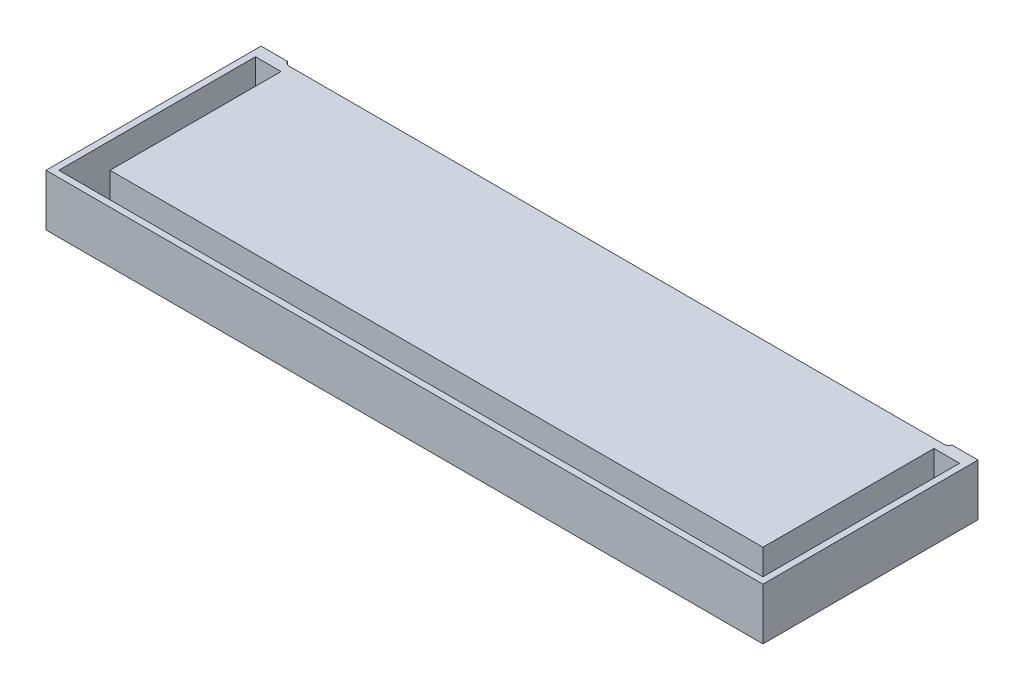
ISO-10303-21;
HEADER;
FILE_DESCRIPTION(('STEP AP214'),'2;1');
FILE_NAME('part.step','',(''),(''),'','','');
FILE_SCHEMA(('AUTOMOTIVE_DESIGN { 1 0 10303 214 1 1 1 1 }'));
ENDSEC;
DATA;
#1=APPLICATION_CONTEXT('core data for automotive mechanical design processes');
#2=APPLICATION_PROTOCOL_DEFINITION('international standard','automotive_design',2000,#1);
#3=PRODUCT_CONTEXT('',#1,'mechanical');
#4=PRODUCT('Part','Part','',(#3));
#5=PRODUCT_RELATED_PRODUCT_CATEGORY('part','',(#4));
#6=PRODUCT_DEFINITION_FORMATION('','',#4);
#7=PRODUCT_DEFINITION_CONTEXT('part definition',#1,'design');
#8=PRODUCT_DEFINITION('design','',#6,#7);
#9=PRODUCT_DEFINITION_SHAPE('','',#8);
#10=(LENGTH_UNIT() NAMED_UNIT(*) SI_UNIT(.MILLI.,.METRE.));
#11=(NAMED_UNIT(*) PLANE_ANGLE_UNIT() SI_UNIT($,.RADIAN.));
#12=(NAMED_UNIT(*) SI_UNIT($,.STERADIAN.) SOLID_ANGLE_UNIT());
#13=UNCERTAINTY_MEASURE_WITH_UNIT(LENGTH_MEASURE(1.E-05),#10,'distance_accuracy_value','');
#14=(GEOMETRIC_REPRESENTATION_CONTEXT(3) GLOBAL_UNCERTAINTY_ASSIGNED_CONTEXT((#13)) GLOBAL_UNIT_ASSIGNED_CONTEXT((#10,
#11,#12)) REPRESENTATION_CONTEXT('',''));
#15=CARTESIAN_POINT('',(0.,0.,0.));
#16=DIRECTION('',(0.,0.,1.));
#17=DIRECTION('',(1.,0.,0.));
#18=AXIS2_PLACEMENT_3D('',#15,#16,#17);
#19=CARTESIAN_POINT('',(157.5,-68.1212867515907,56.6819062459587));
#20=DIRECTION('',(0.,0.,1.));
#21=DIRECTION('',(1.,0.,0.));
#22=AXIS2_PLACEMENT_3D('',#19,#20,#21);
#23=PLANE('',#22);
#24=DIRECTION('',(1.,0.,0.));
#25=VECTOR('',#24,1.);
#26=CARTESIAN_POINT('',(157.5,-66.1009999999994,56.6819062459587));
#27=LINE('',#26,#25);
#28=CARTESIAN_POINT('',(144.719525115767,-66.1009999999995,56.6819062459588));
#29=VERTEX_POINT('',#28);
#30=CARTESIAN_POINT('',(170.299999999999,-66.1009999999994,56.6819062459587));
#31=VERTEX_POINT('',#30);
#32=EDGE_CURVE('E233',#29,#31,#27,.T.);
#33=ORIENTED_EDGE('',*,*,#32,.T.);
#34=DIRECTION('',(0.,1.,0.));
#35=VECTOR('',#34,1.);
#36=CARTESIAN_POINT('',(170.299999999999,-68.1212867515907,56.6819062459587));
#37=LINE('',#36,#35);
#38=CARTESIAN_POINT('',(170.299999999999,-68.1212867515907,56.6819062459587));
#39=VERTEX_POINT('',#38);
#40=EDGE_CURVE('E36',#39,#31,#37,.T.);
#41=ORIENTED_EDGE('',*,*,#40,.F.);
#42=DIRECTION('',(1.,0.,0.));
#43=VECTOR('',#42,1.);
#44=CARTESIAN_POINT('',(157.5,-68.1212867515907,56.6819062459587));
#45=LINE('',#44,#43);
#46=CARTESIAN_POINT('',(144.719525115767,-68.1212867515908,56.6819062459588));
#47=VERTEX_POINT('',#46);
#48=EDGE_CURVE('E234',#47,#39,#45,.T.);
#49=ORIENTED_EDGE('',*,*,#48,.F.);
#50=CARTESIAN_POINT('',(144.719525115767,-66.1009999999995,56.6819062459582));
#51=DIRECTION('',(0.,-1.,0.));
#52=VECTOR('',#51,1.);
#53=LINE('',#50,#52);
#54=EDGE_CURVE('E10',#47,#29,#53,.F.);
#55=ORIENTED_EDGE('',*,*,#54,.T.);
#56=EDGE_LOOP('',(#33,#41,#49,#55));
#57=FACE_BOUND('',#56,.T.);
#58=ADVANCED_FACE('F16',(#57),#23,.F.);
#59=CARTESIAN_POINT('',(144.719525115767,-68.121286751594,56.6819062459582));
#60=CARTESIAN_POINT('',(144.63714146266,-68.121286751594,56.6818638421737));
#61=CARTESIAN_POINT('',(144.559411452345,-68.1212867515908,56.6271764319075));
#62=CARTESIAN_POINT('',(144.530820390872,-68.1212867515908,56.5499999999999));
#63=B_SPLINE_CURVE_WITH_KNOTS('',3,(#59,#60,#61,#62),.UNSPECIFIED.,.F.,.F.,(4,4),(0.,1.),.UNSPECIFIED.);
#64=DIRECTION('',(0.,1.,0.));
#65=VECTOR('',#64,1.);
#66=SURFACE_OF_LINEAR_EXTRUSION('',#63,#65);
#67=CARTESIAN_POINT('',(144.530820390872,-66.1009999999995,56.5499999999999));
#68=CARTESIAN_POINT('',(144.559411452345,-66.1009999999995,56.6271764319075));
#69=CARTESIAN_POINT('',(144.63714146266,-66.1010000000027,56.6818638421737));
#70=CARTESIAN_POINT('',(144.719525115767,-66.1010000000027,56.6819062459582));
#71=B_SPLINE_CURVE_WITH_KNOTS('',3,(#67,#68,#69,#70),.UNSPECIFIED.,.F.,.F.,(4,4),(0.,1.),.UNSPECIFIED.);
#72=CARTESIAN_POINT('',(144.530820390872,-66.1009999999995,56.5499999999999));
#73=VERTEX_POINT('',#72);
#74=EDGE_CURVE('E236',#29,#73,#71,.F.);
#75=ORIENTED_EDGE('',*,*,#74,.F.);
#76=ORIENTED_EDGE('',*,*,#54,.F.);
#77=CARTESIAN_POINT('',(144.719525115767,-68.1212867515908,56.6819062459582));
#78=CARTESIAN_POINT('',(144.63714146266,-68.1212867515908,56.6818638421737));
#79=CARTESIAN_POINT('',(144.559411452345,-68.1212867515876,56.6271764319075));
#80=CARTESIAN_POINT('',(144.530820390872,-68.1212867515876,56.5499999999999));
#81=B_SPLINE_CURVE_WITH_KNOTS('',3,(#77,#78,#79,#80),.UNSPECIFIED.,.F.,.F.,(4,4),(0.,1.),.UNSPECIFIED.);
#82=CARTESIAN_POINT('',(144.530820390872,-68.1212867515908,56.5499999999999));
#83=VERTEX_POINT('',#82);
#84=EDGE_CURVE('E176',#47,#83,#81,.T.);
#85=ORIENTED_EDGE('',*,*,#84,.T.);
#86=CARTESIAN_POINT('',(144.530820390872,-68.1212867515908,56.5499999999999));
#87=DIRECTION('',(0.,1.,0.));
#88=VECTOR('',#87,1.);
#89=LINE('',#86,#88);
#90=EDGE_CURVE('E28',#83,#73,#89,.T.);
#91=ORIENTED_EDGE('',*,*,#90,.T.);
#92=EDGE_LOOP('',(#75,#76,#85,#91));
#93=FACE_BOUND('',#92,.T.);
#94=ADVANCED_FACE('F188',(#93),#66,.T.);
#95=CARTESIAN_POINT('',(157.5,-68.1212867515907,56.5499999999999));
#96=DIRECTION('',(0.,0.,-1.));
#97=DIRECTION('',(-1.,0.,0.));
#98=AXIS2_PLACEMENT_3D('',#95,#96,#97);
#99=PLANE('',#98);
#100=DIRECTION('',(-1.,0.,0.));
#101=VECTOR('',#100,1.);
#102=CARTESIAN_POINT('',(157.5,-66.1009999999994,56.5499999999999));
#103=LINE('',#102,#101);
#104=CARTESIAN_POINT('',(143.5,-66.1009999999995,56.5499999999999));
#105=VERTEX_POINT('',#104);
#106=EDGE_CURVE('E240',#73,#105,#103,.T.);
#107=ORIENTED_EDGE('',*,*,#106,.F.);
#108=ORIENTED_EDGE('',*,*,#90,.F.);
#109=DIRECTION('',(-1.,0.,0.));
#110=VECTOR('',#109,1.);
#111=CARTESIAN_POINT('',(157.5,-68.1212867515907,56.5499999999999));
#112=LINE('',#111,#110);
#113=CARTESIAN_POINT('',(143.5,-68.1212867515908,56.5499999999999));
#114=VERTEX_POINT('',#113);
#115=EDGE_CURVE('E172',#83,#114,#112,.T.);
#116=ORIENTED_EDGE('',*,*,#115,.T.);
#117=DIRECTION('',(0.,1.,0.));
#118=VECTOR('',#117,1.);
#119=CARTESIAN_POINT('',(143.5,-68.1212867515908,56.5499999999999));
#120=LINE('',#119,#118);
#121=EDGE_CURVE('E345',#114,#105,#120,.T.);
#122=ORIENTED_EDGE('',*,*,#121,.T.);
#123=EDGE_LOOP('',(#107,#108,#116,#122));
#124=FACE_BOUND('',#123,.T.);
#125=ADVANCED_FACE('F192',(#124),#99,.T.);
#126=CARTESIAN_POINT('',(143.5,-68.1212867515908,63.6999999999999));
#127=DIRECTION('',(-1.,0.,0.));
#128=DIRECTION('',(0.,-1.,0.));
#129=AXIS2_PLACEMENT_3D('',#126,#127,#128);
#130=PLANE('',#129);
#131=DIRECTION('',(0.,0.,1.));
#132=VECTOR('',#131,1.);
#133=CARTESIAN_POINT('',(143.5,-66.1009999999995,63.6999999999999));
#134=LINE('',#133,#132);
#135=CARTESIAN_POINT('',(143.5,-66.1009999999995,64.9499999999999));
#136=VERTEX_POINT('',#135);
#137=EDGE_CURVE('E257',#105,#136,#134,.T.);
#138=ORIENTED_EDGE('',*,*,#137,.F.);
#139=ORIENTED_EDGE('',*,*,#121,.F.);
#140=DIRECTION('',(0.,0.,1.));
#141=VECTOR('',#140,1.);
#142=CARTESIAN_POINT('',(143.5,-68.1212867515908,63.6999999999999));
#143=LINE('',#142,#141);
#144=CARTESIAN_POINT('',(143.5,-68.1212867515908,64.9499999999999));
#145=VERTEX_POINT('',#144);
#146=EDGE_CURVE('E169',#114,#145,#143,.T.);
#147=ORIENTED_EDGE('',*,*,#146,.T.);
#148=DIRECTION('',(0.,1.,0.));
#149=VECTOR('',#148,1.);
#150=CARTESIAN_POINT('',(143.5,-68.1212867515908,64.9499999999999));
#151=LINE('',#150,#149);
#152=EDGE_CURVE('E347',#145,#136,#151,.T.);
#153=ORIENTED_EDGE('',*,*,#152,.T.);
#154=EDGE_LOOP('',(#138,#139,#147,#153));
#155=FACE_BOUND('',#154,.T.);
#156=ADVANCED_FACE('F194',(#155),#130,.T.);
#157=CARTESIAN_POINT('',(157.5,-68.1212867515907,64.9499999999999));
#158=DIRECTION('',(0.,0.,1.));
#159=DIRECTION('',(1.,0.,0.));
#160=AXIS2_PLACEMENT_3D('',#157,#158,#159);
#161=PLANE('',#160);
#162=DIRECTION('',(1.,0.,0.));
#163=VECTOR('',#162,1.);
#164=CARTESIAN_POINT('',(157.5,-66.1009999999994,64.9499999999999));
#165=LINE('',#164,#163);
#166=CARTESIAN_POINT('',(171.5,-66.1009999999994,64.9499999999999));
#167=VERTEX_POINT('',#166);
#168=EDGE_CURVE('E264',#136,#167,#165,.T.);
#169=ORIENTED_EDGE('',*,*,#168,.F.);
#170=ORIENTED_EDGE('',*,*,#152,.F.);
#171=DIRECTION('',(1.,0.,0.));
#172=VECTOR('',#171,1.);
#173=CARTESIAN_POINT('',(157.5,-68.1212867515907,64.9499999999999));
#174=LINE('',#173,#172);
#175=CARTESIAN_POINT('',(171.5,-68.1212867515907,64.9499999999999));
#176=VERTEX_POINT('',#175);
#177=EDGE_CURVE('E156',#145,#176,#174,.T.);
#178=ORIENTED_EDGE('',*,*,#177,.T.);
#179=DIRECTION('',(0.,1.,0.));
#180=VECTOR('',#179,1.);
#181=CARTESIAN_POINT('',(171.5,-68.1212867515907,64.9499999999999));
#182=LINE('',#181,#180);
#183=EDGE_CURVE('E148',#176,#167,#182,.T.);
#184=ORIENTED_EDGE('',*,*,#183,.T.);
#185=EDGE_LOOP('',(#169,#170,#178,#184));
#186=FACE_BOUND('',#185,.T.);
#187=ADVANCED_FACE('F411',(#186),#161,.T.);
#188=CARTESIAN_POINT('',(171.5,-68.1212867515907,63.6999999999999));
#189=DIRECTION('',(1.,0.,0.));
#190=DIRECTION('',(0.,1.,0.));
#191=AXIS2_PLACEMENT_3D('',#188,#189,#190);
#192=PLANE('',#191);
#193=DIRECTION('',(0.,0.,-1.));
#194=VECTOR('',#193,1.);
#195=CARTESIAN_POINT('',(171.5,-66.1009999999994,63.6999999999999));
#196=LINE('',#195,#194);
#197=CARTESIAN_POINT('',(171.5,-66.1009999999994,56.5499999999999));
#198=VERTEX_POINT('',#197);
#199=EDGE_CURVE('E260',#167,#198,#196,.T.);
#200=ORIENTED_EDGE('',*,*,#199,.F.);
#201=ORIENTED_EDGE('',*,*,#183,.F.);
#202=DIRECTION('',(0.,0.,-1.));
#203=VECTOR('',#202,1.);
#204=CARTESIAN_POINT('',(171.5,-68.1212867515907,63.6999999999999));
#205=LINE('',#204,#203);
#206=CARTESIAN_POINT('',(171.5,-68.1212867515907,56.5499999999999));
#207=VERTEX_POINT('',#206);
#208=EDGE_CURVE('E151',#176,#207,#205,.T.);
#209=ORIENTED_EDGE('',*,*,#208,.T.);
#210=DIRECTION('',(0.,1.,0.));
#211=VECTOR('',#210,1.);
#212=CARTESIAN_POINT('',(171.5,-68.1212867515907,56.5499999999999));
#213=LINE('',#212,#211);
#214=EDGE_CURVE('E137',#207,#198,#213,.T.);
#215=ORIENTED_EDGE('',*,*,#214,.T.);
#216=EDGE_LOOP('',(#200,#201,#209,#215));
#217=FACE_BOUND('',#216,.T.);
#218=ADVANCED_FACE('F152',(#217),#192,.T.);
#219=CARTESIAN_POINT('',(170.487868651815,-66.1009999999994,56.5499999999999));
#220=VERTEX_POINT('',#219);
#221=EDGE_CURVE('E144',#198,#220,#103,.T.);
#222=ORIENTED_EDGE('',*,*,#221,.F.);
#223=ORIENTED_EDGE('',*,*,#214,.F.);
#224=CARTESIAN_POINT('',(170.487868651815,-68.1212867515907,56.5499999999999));
#225=VERTEX_POINT('',#224);
#226=EDGE_CURVE('E141',#207,#225,#112,.T.);
#227=ORIENTED_EDGE('',*,*,#226,.T.);
#228=DIRECTION('',(0.,1.,0.));
#229=VECTOR('',#228,1.);
#230=CARTESIAN_POINT('',(170.487868651815,-68.1212867515907,56.5499999999999));
#231=LINE('',#230,#229);
#232=EDGE_CURVE('E88',#225,#220,#231,.T.);
#233=ORIENTED_EDGE('',*,*,#232,.T.);
#234=EDGE_LOOP('',(#222,#223,#227,#233));
#235=FACE_BOUND('',#234,.T.);
#236=ADVANCED_FACE('F139',(#235),#99,.T.);
#237=CARTESIAN_POINT('',(157.5,-68.1212867515907,63.6999999999999));
#238=DIRECTION('',(0.,0.,-1.));
#239=DIRECTION('',(-1.,0.,0.));
#240=AXIS2_PLACEMENT_3D('',#237,#238,#239);
#241=PLANE('',#240);
#242=DIRECTION('',(-1.,0.,0.));
#243=VECTOR('',#242,1.);
#244=CARTESIAN_POINT('',(157.5,-66.1009999999994,63.6999999999999));
#245=LINE('',#244,#243);
#246=CARTESIAN_POINT('',(170.25,-66.1009999999994,63.6999999999999));
#247=VERTEX_POINT('',#246);
#248=CARTESIAN_POINT('',(144.75,-66.1009999999995,63.6999999999999));
#249=VERTEX_POINT('',#248);
#250=EDGE_CURVE('E295',#247,#249,#245,.T.);
#251=ORIENTED_EDGE('',*,*,#250,.T.);
#252=DIRECTION('',(0.,1.,0.));
#253=VECTOR('',#252,1.);
#254=CARTESIAN_POINT('',(144.75,-68.1212867515908,63.6999999999999));
#255=LINE('',#254,#253);
#256=CARTESIAN_POINT('',(144.75,-68.1212867515908,63.6999999999999));
#257=VERTEX_POINT('',#256);
#258=EDGE_CURVE('E162',#257,#249,#255,.T.);
#259=ORIENTED_EDGE('',*,*,#258,.F.);
#260=DIRECTION('',(-1.,0.,0.));
#261=VECTOR('',#260,1.);
#262=CARTESIAN_POINT('',(157.5,-68.1212867515907,63.6999999999999));
#263=LINE('',#262,#261);
#264=CARTESIAN_POINT('',(170.25,-68.1212867515907,63.6999999999999));
#265=VERTEX_POINT('',#264);
#266=EDGE_CURVE('E269',#265,#257,#263,.T.);
#267=ORIENTED_EDGE('',*,*,#266,.F.);
#268=DIRECTION('',(0.,1.,0.));
#269=VECTOR('',#268,1.);
#270=CARTESIAN_POINT('',(170.25,-68.1212867515907,63.6999999999999));
#271=LINE('',#270,#269);
#272=EDGE_CURVE('E99',#265,#247,#271,.T.);
#273=ORIENTED_EDGE('',*,*,#272,.T.);
#274=EDGE_LOOP('',(#251,#259,#267,#273));
#275=FACE_BOUND('',#274,.T.);
#276=ADVANCED_FACE('F18',(#275),#241,.F.);
#277=CARTESIAN_POINT('',(170.25,-68.1212867515907,63.6999999999999));
#278=DIRECTION('',(-1.,0.,0.));
#279=DIRECTION('',(0.,-1.,0.));
#280=AXIS2_PLACEMENT_3D('',#277,#278,#279);
#281=PLANE('',#280);
#282=DIRECTION('',(0.,0.,1.));
#283=VECTOR('',#282,1.);
#284=CARTESIAN_POINT('',(170.25,-66.1009999999994,63.6999999999999));
#285=LINE('',#284,#283);
#286=CARTESIAN_POINT('',(170.25,-66.1009999999994,57.0186341701512));
#287=VERTEX_POINT('',#286);
#288=EDGE_CURVE('E298',#287,#247,#285,.T.);
#289=ORIENTED_EDGE('',*,*,#288,.T.);
#290=ORIENTED_EDGE('',*,*,#272,.F.);
#291=DIRECTION('',(0.,0.,1.));
#292=VECTOR('',#291,1.);
#293=CARTESIAN_POINT('',(170.25,-68.1212867515907,63.6999999999999));
#294=LINE('',#293,#292);
#295=CARTESIAN_POINT('',(170.25,-68.1212867515907,57.0186341701512));
#296=VERTEX_POINT('',#295);
#297=EDGE_CURVE('E380',#296,#265,#294,.T.);
#298=ORIENTED_EDGE('',*,*,#297,.F.);
#299=DIRECTION('',(0.,1.,0.));
#300=VECTOR('',#299,1.);
#301=CARTESIAN_POINT('',(170.25,-68.1212867515907,57.0186341701512));
#302=LINE('',#301,#300);
#303=EDGE_CURVE('E340',#296,#287,#302,.T.);
#304=ORIENTED_EDGE('',*,*,#303,.T.);
#305=EDGE_LOOP('',(#289,#290,#298,#304));
#306=FACE_BOUND('',#305,.T.);
#307=ADVANCED_FACE('F358',(#306),#281,.F.);
#308=CARTESIAN_POINT('',(157.5,-68.1212867515907,57.0186341701512));
#309=DIRECTION('',(0.,0.,-1.));
#310=DIRECTION('',(-1.,0.,0.));
#311=AXIS2_PLACEMENT_3D('',#308,#309,#310);
#312=PLANE('',#311);
#313=DIRECTION('',(1.,0.,0.));
#314=VECTOR('',#313,1.);
#315=CARTESIAN_POINT('',(157.5,-66.1009999999994,57.0186341701512));
#316=LINE('',#315,#314);
#317=CARTESIAN_POINT('',(171.25,-66.1009999999994,57.0186341701512));
#318=VERTEX_POINT('',#317);
#319=EDGE_CURVE('E300',#318,#287,#316,.F.);
#320=ORIENTED_EDGE('',*,*,#319,.T.);
#321=ORIENTED_EDGE('',*,*,#303,.F.);
#322=DIRECTION('',(1.,0.,0.));
#323=VECTOR('',#322,1.);
#324=CARTESIAN_POINT('',(157.5,-68.1212867515907,57.0186341701512));
#325=LINE('',#324,#323);
#326=CARTESIAN_POINT('',(171.25,-68.1212867515907,57.0186341701512));
#327=VERTEX_POINT('',#326);
#328=EDGE_CURVE('E364',#327,#296,#325,.F.);
#329=ORIENTED_EDGE('',*,*,#328,.F.);
#330=DIRECTION('',(0.,1.,0.));
#331=VECTOR('',#330,1.);
#332=CARTESIAN_POINT('',(171.25,-68.1212867515907,57.0186341701512));
#333=LINE('',#332,#331);
#334=EDGE_CURVE('E338',#327,#318,#333,.T.);
#335=ORIENTED_EDGE('',*,*,#334,.T.);
#336=EDGE_LOOP('',(#320,#321,#329,#335));
#337=FACE_BOUND('',#336,.T.);
#338=ADVANCED_FACE('F361',(#337),#312,.F.);
#339=CARTESIAN_POINT('',(171.25,-68.1212867515907,63.6999999999999));
#340=DIRECTION('',(1.,0.,0.));
#341=DIRECTION('',(0.,1.,0.));
#342=AXIS2_PLACEMENT_3D('',#339,#340,#341);
#343=PLANE('',#342);
#344=DIRECTION('',(0.,0.,-1.));
#345=VECTOR('',#344,1.);
#346=CARTESIAN_POINT('',(171.25,-66.1009999999994,63.6999999999999));
#347=LINE('',#346,#345);
#348=CARTESIAN_POINT('',(171.25,-66.1009999999994,64.6999999999999));
#349=VERTEX_POINT('',#348);
#350=EDGE_CURVE('E303',#349,#318,#347,.T.);
#351=ORIENTED_EDGE('',*,*,#350,.T.);
#352=ORIENTED_EDGE('',*,*,#334,.F.);
#353=DIRECTION('',(0.,0.,-1.));
#354=VECTOR('',#353,1.);
#355=CARTESIAN_POINT('',(171.25,-68.1212867515907,63.6999999999999));
#356=LINE('',#355,#354);
#357=CARTESIAN_POINT('',(171.25,-68.1212867515907,64.6999999999999));
#358=VERTEX_POINT('',#357);
#359=EDGE_CURVE('E369',#358,#327,#356,.T.);
#360=ORIENTED_EDGE('',*,*,#359,.F.);
#361=DIRECTION('',(0.,1.,0.));
#362=VECTOR('',#361,1.);
#363=CARTESIAN_POINT('',(171.25,-68.1212867515907,64.6999999999999));
#364=LINE('',#363,#362);
#365=EDGE_CURVE('E332',#358,#349,#364,.T.);
#366=ORIENTED_EDGE('',*,*,#365,.T.);
#367=EDGE_LOOP('',(#351,#352,#360,#366));
#368=FACE_BOUND('',#367,.T.);
#369=ADVANCED_FACE('F368',(#368),#343,.F.);
#370=CARTESIAN_POINT('',(157.5,-68.1212867515907,64.6999999999999));
#371=DIRECTION('',(0.,0.,1.));
#372=DIRECTION('',(0.,-1.,0.));
#373=AXIS2_PLACEMENT_3D('',#370,#371,#372);
#374=PLANE('',#373);
#375=DIRECTION('',(1.,0.,0.));
#376=VECTOR('',#375,1.);
#377=CARTESIAN_POINT('',(157.5,-66.1009999999994,64.6999999999999));
#378=LINE('',#377,#376);
#379=CARTESIAN_POINT('',(143.75,-66.1009999999995,64.6999999999999));
#380=VERTEX_POINT('',#379);
#381=EDGE_CURVE('E306',#380,#349,#378,.T.);
#382=ORIENTED_EDGE('',*,*,#381,.T.);
#383=ORIENTED_EDGE('',*,*,#365,.F.);
#384=DIRECTION('',(1.,0.,0.));
#385=VECTOR('',#384,1.);
#386=CARTESIAN_POINT('',(157.5,-68.1212867515907,64.6999999999999));
#387=LINE('',#386,#385);
#388=CARTESIAN_POINT('',(143.75,-68.1212867515908,64.6999999999999));
#389=VERTEX_POINT('',#388);
#390=EDGE_CURVE('E373',#389,#358,#387,.T.);
#391=ORIENTED_EDGE('',*,*,#390,.F.);
#392=DIRECTION('',(0.,1.,0.));
#393=VECTOR('',#392,1.);
#394=CARTESIAN_POINT('',(143.75,-68.1212867515908,64.6999999999999));
#395=LINE('',#394,#393);
#396=EDGE_CURVE('E326',#389,#380,#395,.T.);
#397=ORIENTED_EDGE('',*,*,#396,.T.);
#398=EDGE_LOOP('',(#382,#383,#391,#397));
#399=FACE_BOUND('',#398,.T.);
#400=ADVANCED_FACE('F372',(#399),#374,.F.);
#401=CARTESIAN_POINT('',(143.75,-68.1212867515908,63.6999999999999));
#402=DIRECTION('',(-1.,0.,0.));
#403=DIRECTION('',(0.,-1.,0.));
#404=AXIS2_PLACEMENT_3D('',#401,#402,#403);
#405=PLANE('',#404);
#406=DIRECTION('',(0.,0.,1.));
#407=VECTOR('',#406,1.);
#408=CARTESIAN_POINT('',(143.75,-66.1009999999995,63.6999999999999));
#409=LINE('',#408,#407);
#410=CARTESIAN_POINT('',(143.75,-66.1009999999995,57.0186341701512));
#411=VERTEX_POINT('',#410);
#412=EDGE_CURVE('E309',#411,#380,#409,.T.);
#413=ORIENTED_EDGE('',*,*,#412,.T.);
#414=ORIENTED_EDGE('',*,*,#396,.F.);
#415=DIRECTION('',(0.,0.,1.));
#416=VECTOR('',#415,1.);
#417=CARTESIAN_POINT('',(143.75,-68.1212867515908,63.6999999999999));
#418=LINE('',#417,#416);
#419=CARTESIAN_POINT('',(143.75,-68.1212867515908,57.0186341701512));
#420=VERTEX_POINT('',#419);
#421=EDGE_CURVE('E329',#420,#389,#418,.T.);
#422=ORIENTED_EDGE('',*,*,#421,.F.);
#423=DIRECTION('',(0.,1.,0.));
#424=VECTOR('',#423,1.);
#425=CARTESIAN_POINT('',(143.75,-68.1212867515908,57.0186341701512));
#426=LINE('',#425,#424);
#427=EDGE_CURVE('E317',#420,#411,#426,.T.);
#428=ORIENTED_EDGE('',*,*,#427,.T.);
#429=EDGE_LOOP('',(#413,#414,#422,#428));
#430=FACE_BOUND('',#429,.T.);
#431=ADVANCED_FACE('F325',(#430),#405,.F.);
#432=CARTESIAN_POINT('',(157.5,-68.1212867515907,57.0186341701512));
#433=DIRECTION('',(0.,0.,-1.));
#434=DIRECTION('',(-1.,0.,0.));
#435=AXIS2_PLACEMENT_3D('',#432,#433,#434);
#436=PLANE('',#435);
#437=DIRECTION('',(1.,0.,0.));
#438=VECTOR('',#437,1.);
#439=CARTESIAN_POINT('',(157.5,-66.1009999999994,57.0186341701512));
#440=LINE('',#439,#438);
#441=CARTESIAN_POINT('',(144.75,-66.1009999999995,57.0186341701512));
#442=VERTEX_POINT('',#441);
#443=EDGE_CURVE('E246',#442,#411,#440,.F.);
#444=ORIENTED_EDGE('',*,*,#443,.T.);
#445=ORIENTED_EDGE('',*,*,#427,.F.);
#446=DIRECTION('',(1.,0.,0.));
#447=VECTOR('',#446,1.);
#448=CARTESIAN_POINT('',(157.5,-68.1212867515907,57.0186341701512));
#449=LINE('',#448,#447);
#450=CARTESIAN_POINT('',(144.75,-68.1212867515908,57.0186341701512));
#451=VERTEX_POINT('',#450);
#452=EDGE_CURVE('E375',#451,#420,#449,.F.);
#453=ORIENTED_EDGE('',*,*,#452,.F.);
#454=DIRECTION('',(0.,1.,0.));
#455=VECTOR('',#454,1.);
#456=CARTESIAN_POINT('',(144.75,-68.1212867515908,57.0186341701512));
#457=LINE('',#456,#455);
#458=EDGE_CURVE('E319',#451,#442,#457,.T.);
#459=ORIENTED_EDGE('',*,*,#458,.T.);
#460=EDGE_LOOP('',(#444,#445,#453,#459));
#461=FACE_BOUND('',#460,.T.);
#462=ADVANCED_FACE('F315',(#461),#436,.F.);
#463=CARTESIAN_POINT('',(144.75,-68.1212867515908,63.6999999999999));
#464=DIRECTION('',(1.,0.,0.));
#465=DIRECTION('',(0.,1.,0.));
#466=AXIS2_PLACEMENT_3D('',#463,#464,#465);
#467=PLANE('',#466);
#468=DIRECTION('',(0.,0.,-1.));
#469=VECTOR('',#468,1.);
#470=CARTESIAN_POINT('',(144.75,-66.1009999999995,63.6999999999999));
#471=LINE('',#470,#469);
#472=EDGE_CURVE('E243',#249,#442,#471,.T.);
#473=ORIENTED_EDGE('',*,*,#472,.T.);
#474=ORIENTED_EDGE('',*,*,#458,.F.);
#475=DIRECTION('',(0.,0.,-1.));
#476=VECTOR('',#475,1.);
#477=CARTESIAN_POINT('',(144.75,-68.1212867515908,63.6999999999999));
#478=LINE('',#477,#476);
#479=EDGE_CURVE('E167',#257,#451,#478,.T.);
#480=ORIENTED_EDGE('',*,*,#479,.F.);
#481=ORIENTED_EDGE('',*,*,#258,.T.);
#482=EDGE_LOOP('',(#473,#474,#480,#481));
#483=FACE_BOUND('',#482,.T.);
#484=ADVANCED_FACE('F290',(#483),#467,.F.);
#485=CARTESIAN_POINT('',(170.299999999999,-68.1212867515907,56.48114227845));
#486=DIRECTION('',(0.,1.,0.));
#487=DIRECTION('',(1.93110003928535E-12,0.,1.));
#488=AXIS2_PLACEMENT_3D('',#485,#486,#487);
#489=ELLIPSE('',#488,0.200763967508669,0.2);
#490=DIRECTION('',(0.,1.,0.));
#491=VECTOR('',#490,1.);
#492=SURFACE_OF_LINEAR_EXTRUSION('',#489,#491);
#493=CARTESIAN_POINT('',(170.299999999999,-66.1009999999994,56.48114227845));
#494=DIRECTION('',(0.,1.,0.));
#495=DIRECTION('',(1.93110003928535E-12,0.,1.));
#496=AXIS2_PLACEMENT_3D('',#493,#494,#495);
#497=ELLIPSE('',#496,0.200763967508669,0.2);
#498=EDGE_CURVE('E242',#31,#220,#497,.T.);
#499=ORIENTED_EDGE('',*,*,#498,.T.);
#500=ORIENTED_EDGE('',*,*,#232,.F.);
#501=EDGE_CURVE('E160',#39,#225,#489,.T.);
#502=ORIENTED_EDGE('',*,*,#501,.F.);
#503=ORIENTED_EDGE('',*,*,#40,.T.);
#504=EDGE_LOOP('',(#499,#500,#502,#503));
#505=FACE_BOUND('',#504,.T.);
#506=ADVANCED_FACE('F282',(#505),#492,.F.);
#507=CARTESIAN_POINT('',(157.5,-68.1212867515907,63.6999999999999));
#508=DIRECTION('',(0.,1.,0.));
#509=DIRECTION('',(-1.,0.,0.));
#510=AXIS2_PLACEMENT_3D('',#507,#508,#509);
#511=PLANE('',#510);
#512=ORIENTED_EDGE('',*,*,#266,.T.);
#513=ORIENTED_EDGE('',*,*,#479,.T.);
#514=ORIENTED_EDGE('',*,*,#452,.T.);
#515=ORIENTED_EDGE('',*,*,#421,.T.);
#516=ORIENTED_EDGE('',*,*,#390,.T.);
#517=ORIENTED_EDGE('',*,*,#359,.T.);
#518=ORIENTED_EDGE('',*,*,#328,.T.);
#519=ORIENTED_EDGE('',*,*,#297,.T.);
#520=EDGE_LOOP('',(#512,#513,#514,#515,#516,#517,#518,#519));
#521=FACE_BOUND('',#520,.T.);
#522=ORIENTED_EDGE('',*,*,#48,.T.);
#523=ORIENTED_EDGE('',*,*,#501,.T.);
#524=ORIENTED_EDGE('',*,*,#226,.F.);
#525=ORIENTED_EDGE('',*,*,#208,.F.);
#526=ORIENTED_EDGE('',*,*,#177,.F.);
#527=ORIENTED_EDGE('',*,*,#146,.F.);
#528=ORIENTED_EDGE('',*,*,#115,.F.);
#529=ORIENTED_EDGE('',*,*,#84,.F.);
#530=EDGE_LOOP('',(#522,#523,#524,#525,#526,#527,#528,#529));
#531=FACE_BOUND('',#530,.T.);
#532=ADVANCED_FACE('F159',(#521,#531),#511,.F.);
#533=CARTESIAN_POINT('',(157.5,-66.1009999999994,63.6999999999999));
#534=DIRECTION('',(0.,1.,0.));
#535=DIRECTION('',(-1.,0.,0.));
#536=AXIS2_PLACEMENT_3D('',#533,#534,#535);
#537=PLANE('',#536);
#538=ORIENTED_EDGE('',*,*,#250,.F.);
#539=ORIENTED_EDGE('',*,*,#288,.F.);
#540=ORIENTED_EDGE('',*,*,#319,.F.);
#541=ORIENTED_EDGE('',*,*,#350,.F.);
#542=ORIENTED_EDGE('',*,*,#381,.F.);
#543=ORIENTED_EDGE('',*,*,#412,.F.);
#544=ORIENTED_EDGE('',*,*,#443,.F.);
#545=ORIENTED_EDGE('',*,*,#472,.F.);
#546=EDGE_LOOP('',(#538,#539,#540,#541,#542,#543,#544,#545));
#547=FACE_BOUND('',#546,.T.);
#548=ORIENTED_EDGE('',*,*,#32,.F.);
#549=ORIENTED_EDGE('',*,*,#74,.T.);
#550=ORIENTED_EDGE('',*,*,#106,.T.);
#551=ORIENTED_EDGE('',*,*,#137,.T.);
#552=ORIENTED_EDGE('',*,*,#168,.T.);
#553=ORIENTED_EDGE('',*,*,#199,.T.);
#554=ORIENTED_EDGE('',*,*,#221,.T.);
#555=ORIENTED_EDGE('',*,*,#498,.F.);
#556=EDGE_LOOP('',(#548,#549,#550,#551,#552,#553,#554,#555));
#557=FACE_BOUND('',#556,.T.);
#558=ADVANCED_FACE('F241',(#547,#557),#537,.T.);
#559=CLOSED_SHELL('',(#58,#94,#125,#156,#187,#218,#236,#276,#307,#338,#369,#400,#431,#462,#484,
#506,#532,#558));
#560=MANIFOLD_SOLID_BREP('B1',#559);
#561=ADVANCED_BREP_SHAPE_REPRESENTATION('',(#18,#560),#14);
#562=SHAPE_DEFINITION_REPRESENTATION(#9,#561);
ENDSEC;
END-ISO-10303-21;
